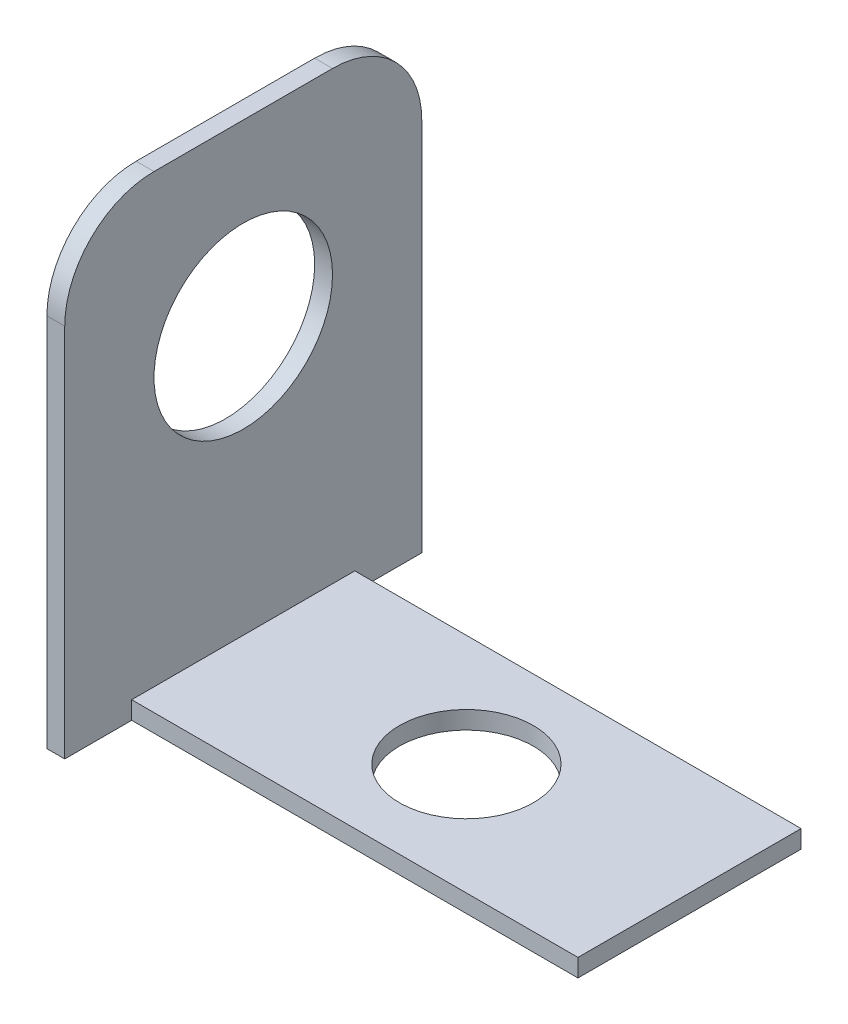
ISO-10303-21;
HEADER;
FILE_DESCRIPTION(('STEP AP214'),'2;1');
FILE_NAME('part.step','',(''),(''),'','','');
FILE_SCHEMA(('AUTOMOTIVE_DESIGN { 1 0 10303 214 1 1 1 1 }'));
ENDSEC;
DATA;
#1=APPLICATION_CONTEXT('core data for automotive mechanical design processes');
#2=APPLICATION_PROTOCOL_DEFINITION('international standard','automotive_design',2000,#1);
#3=PRODUCT_CONTEXT('',#1,'mechanical');
#4=PRODUCT('Part','Part','',(#3));
#5=PRODUCT_RELATED_PRODUCT_CATEGORY('part','',(#4));
#6=PRODUCT_DEFINITION_FORMATION('','',#4);
#7=PRODUCT_DEFINITION_CONTEXT('part definition',#1,'design');
#8=PRODUCT_DEFINITION('design','',#6,#7);
#9=PRODUCT_DEFINITION_SHAPE('','',#8);
#10=(LENGTH_UNIT() NAMED_UNIT(*) SI_UNIT(.MILLI.,.METRE.));
#11=(NAMED_UNIT(*) PLANE_ANGLE_UNIT() SI_UNIT($,.RADIAN.));
#12=(NAMED_UNIT(*) SI_UNIT($,.STERADIAN.) SOLID_ANGLE_UNIT());
#13=UNCERTAINTY_MEASURE_WITH_UNIT(LENGTH_MEASURE(1.E-05),#10,'distance_accuracy_value','');
#14=(GEOMETRIC_REPRESENTATION_CONTEXT(3) GLOBAL_UNCERTAINTY_ASSIGNED_CONTEXT((#13)) GLOBAL_UNIT_ASSIGNED_CONTEXT((#10,
#11,#12)) REPRESENTATION_CONTEXT('',''));
#15=CARTESIAN_POINT('',(0.,0.,0.));
#16=DIRECTION('',(0.,0.,1.));
#17=DIRECTION('',(1.,0.,0.));
#18=AXIS2_PLACEMENT_3D('',#15,#16,#17);
#19=CARTESIAN_POINT('',(50.,0.,40.));
#20=DIRECTION('',(0.,-1.,0.));
#21=DIRECTION('',(1.,0.,0.));
#22=AXIS2_PLACEMENT_3D('',#19,#20,#21);
#23=PLANE('',#22);
#24=CARTESIAN_POINT('',(25.,0.,20.));
#25=DIRECTION('',(0.,1.,0.));
#26=DIRECTION('',(-1.,0.,0.));
#27=AXIS2_PLACEMENT_3D('',#24,#25,#26);
#28=CIRCLE('',#27,7.5);
#29=CARTESIAN_POINT('',(17.5,0.,20.));
#30=VERTEX_POINT('',#29);
#31=EDGE_CURVE('E186',#30,#30,#28,.T.);
#32=ORIENTED_EDGE('',*,*,#31,.F.);
#33=EDGE_LOOP('',(#32));
#34=FACE_BOUND('',#33,.T.);
#35=DIRECTION('',(0.,0.,-1.));
#36=VECTOR('',#35,1.);
#37=CARTESIAN_POINT('',(0.,0.,40.));
#38=LINE('',#37,#36);
#39=CARTESIAN_POINT('',(0.,0.,32.5));
#40=VERTEX_POINT('',#39);
#41=CARTESIAN_POINT('',(0.,0.,7.5));
#42=VERTEX_POINT('',#41);
#43=EDGE_CURVE('E141',#40,#42,#38,.T.);
#44=ORIENTED_EDGE('',*,*,#43,.F.);
#45=DIRECTION('',(-1.,0.,0.));
#46=VECTOR('',#45,1.);
#47=CARTESIAN_POINT('',(0.,0.,32.5));
#48=LINE('',#47,#46);
#49=CARTESIAN_POINT('',(50.,0.,32.5));
#50=VERTEX_POINT('',#49);
#51=EDGE_CURVE('E125',#50,#40,#48,.T.);
#52=ORIENTED_EDGE('',*,*,#51,.F.);
#53=DIRECTION('',(0.,0.,-1.));
#54=VECTOR('',#53,1.);
#55=CARTESIAN_POINT('',(50.,0.,40.));
#56=LINE('',#55,#54);
#57=CARTESIAN_POINT('',(50.,0.,7.5));
#58=VERTEX_POINT('',#57);
#59=EDGE_CURVE('E139',#50,#58,#56,.T.);
#60=ORIENTED_EDGE('',*,*,#59,.T.);
#61=DIRECTION('',(-1.,0.,0.));
#62=VECTOR('',#61,1.);
#63=CARTESIAN_POINT('',(0.,0.,7.5));
#64=LINE('',#63,#62);
#65=EDGE_CURVE('E252',#58,#42,#64,.T.);
#66=ORIENTED_EDGE('',*,*,#65,.T.);
#67=EDGE_LOOP('',(#44,#52,#60,#66));
#68=FACE_BOUND('',#67,.T.);
#69=ADVANCED_FACE('F41',(#34,#68),#23,.F.);
#70=CARTESIAN_POINT('',(-2.,-1.99999999999999,40.));
#71=DIRECTION('',(0.,1.,0.));
#72=DIRECTION('',(0.,0.,1.));
#73=AXIS2_PLACEMENT_3D('',#70,#71,#72);
#74=PLANE('',#73);
#75=CARTESIAN_POINT('',(25.,-1.99999999999999,20.));
#76=DIRECTION('',(0.,1.,0.));
#77=DIRECTION('',(0.,0.,1.));
#78=AXIS2_PLACEMENT_3D('',#75,#76,#77);
#79=CIRCLE('',#78,7.5);
#80=CARTESIAN_POINT('',(25.,-1.99999999999999,27.5));
#81=VERTEX_POINT('',#80);
#82=EDGE_CURVE('E182',#81,#81,#79,.T.);
#83=ORIENTED_EDGE('',*,*,#82,.T.);
#84=EDGE_LOOP('',(#83));
#85=FACE_BOUND('',#84,.T.);
#86=DIRECTION('',(-1.,0.,0.));
#87=VECTOR('',#86,1.);
#88=CARTESIAN_POINT('',(-2.,-1.99999999999999,32.5));
#89=LINE('',#88,#87);
#90=CARTESIAN_POINT('',(50.,-2.,32.5));
#91=VERTEX_POINT('',#90);
#92=CARTESIAN_POINT('',(0.,-2.,32.5));
#93=VERTEX_POINT('',#92);
#94=EDGE_CURVE('E128',#91,#93,#89,.T.);
#95=ORIENTED_EDGE('',*,*,#94,.T.);
#96=DIRECTION('',(0.,0.,1.));
#97=VECTOR('',#96,1.);
#98=CARTESIAN_POINT('',(0.,-1.99999999999999,40.));
#99=LINE('',#98,#97);
#100=CARTESIAN_POINT('',(0.,-2.,40.));
#101=VERTEX_POINT('',#100);
#102=EDGE_CURVE('E242',#93,#101,#99,.T.);
#103=ORIENTED_EDGE('',*,*,#102,.T.);
#104=DIRECTION('',(1.,0.,0.));
#105=VECTOR('',#104,1.);
#106=CARTESIAN_POINT('',(-2.,-1.99999999999999,40.));
#107=LINE('',#106,#105);
#108=CARTESIAN_POINT('',(-2.,-1.99999999999999,40.));
#109=VERTEX_POINT('',#108);
#110=EDGE_CURVE('E150',#109,#101,#107,.T.);
#111=ORIENTED_EDGE('',*,*,#110,.F.);
#112=DIRECTION('',(0.,0.,-1.));
#113=VECTOR('',#112,1.);
#114=CARTESIAN_POINT('',(-2.,-1.99999999999999,40.));
#115=LINE('',#114,#113);
#116=CARTESIAN_POINT('',(-2.,-1.99999999999999,0.));
#117=VERTEX_POINT('',#116);
#118=EDGE_CURVE('E154',#109,#117,#115,.T.);
#119=ORIENTED_EDGE('',*,*,#118,.T.);
#120=DIRECTION('',(1.,0.,0.));
#121=VECTOR('',#120,1.);
#122=CARTESIAN_POINT('',(-2.,-1.99999999999999,0.));
#123=LINE('',#122,#121);
#124=CARTESIAN_POINT('',(0.,-1.99999999999999,0.));
#125=VERTEX_POINT('',#124);
#126=EDGE_CURVE('E160',#117,#125,#123,.T.);
#127=ORIENTED_EDGE('',*,*,#126,.T.);
#128=DIRECTION('',(0.,0.,1.));
#129=VECTOR('',#128,1.);
#130=CARTESIAN_POINT('',(0.,-1.99999999999999,40.));
#131=LINE('',#130,#129);
#132=CARTESIAN_POINT('',(0.,-2.,7.5));
#133=VERTEX_POINT('',#132);
#134=EDGE_CURVE('E246',#125,#133,#131,.T.);
#135=ORIENTED_EDGE('',*,*,#134,.T.);
#136=DIRECTION('',(-1.,0.,0.));
#137=VECTOR('',#136,1.);
#138=CARTESIAN_POINT('',(-2.,-1.99999999999999,7.5));
#139=LINE('',#138,#137);
#140=CARTESIAN_POINT('',(50.,-2.,7.5));
#141=VERTEX_POINT('',#140);
#142=EDGE_CURVE('E239',#141,#133,#139,.T.);
#143=ORIENTED_EDGE('',*,*,#142,.F.);
#144=DIRECTION('',(0.,0.,-1.));
#145=VECTOR('',#144,1.);
#146=CARTESIAN_POINT('',(50.,-1.99999999999999,40.));
#147=LINE('',#146,#145);
#148=EDGE_CURVE('E149',#91,#141,#147,.T.);
#149=ORIENTED_EDGE('',*,*,#148,.F.);
#150=EDGE_LOOP('',(#95,#103,#111,#119,#127,#135,#143,#149));
#151=FACE_BOUND('',#150,.T.);
#152=ADVANCED_FACE('F260',(#85,#151),#74,.F.);
#153=CARTESIAN_POINT('',(50.,-1.99999999999999,40.));
#154=DIRECTION('',(-1.,0.,0.));
#155=DIRECTION('',(0.,0.,1.));
#156=AXIS2_PLACEMENT_3D('',#153,#154,#155);
#157=PLANE('',#156);
#158=ORIENTED_EDGE('',*,*,#59,.F.);
#159=DIRECTION('',(0.,1.,0.));
#160=VECTOR('',#159,1.);
#161=CARTESIAN_POINT('',(50.,-290.,32.5));
#162=LINE('',#161,#160);
#163=EDGE_CURVE('E121',#91,#50,#162,.T.);
#164=ORIENTED_EDGE('',*,*,#163,.F.);
#165=ORIENTED_EDGE('',*,*,#148,.T.);
#166=DIRECTION('',(0.,1.,0.));
#167=VECTOR('',#166,1.);
#168=CARTESIAN_POINT('',(50.,-290.,7.5));
#169=LINE('',#168,#167);
#170=EDGE_CURVE('E147',#141,#58,#169,.T.);
#171=ORIENTED_EDGE('',*,*,#170,.T.);
#172=EDGE_LOOP('',(#158,#164,#165,#171));
#173=FACE_BOUND('',#172,.T.);
#174=ADVANCED_FACE('F146',(#173),#157,.F.);
#175=CARTESIAN_POINT('',(0.,0.,40.));
#176=DIRECTION('',(-1.,0.,0.));
#177=DIRECTION('',(0.,0.,1.));
#178=AXIS2_PLACEMENT_3D('',#175,#176,#177);
#179=PLANE('',#178);
#180=CARTESIAN_POINT('',(0.,30.,20.));
#181=DIRECTION('',(1.,0.,0.));
#182=DIRECTION('',(0.,0.,-1.));
#183=AXIS2_PLACEMENT_3D('',#180,#181,#182);
#184=CIRCLE('',#183,10.);
#185=CARTESIAN_POINT('',(0.,30.,9.99999999999999));
#186=VERTEX_POINT('',#185);
#187=EDGE_CURVE('E181',#186,#186,#184,.T.);
#188=ORIENTED_EDGE('',*,*,#187,.F.);
#189=EDGE_LOOP('',(#188));
#190=FACE_BOUND('',#189,.T.);
#191=DIRECTION('',(0.,1.,0.));
#192=VECTOR('',#191,1.);
#193=CARTESIAN_POINT('',(0.,0.,0.));
#194=LINE('',#193,#192);
#195=CARTESIAN_POINT('',(0.,40.,0.));
#196=VERTEX_POINT('',#195);
#197=EDGE_CURVE('E57',#125,#196,#194,.T.);
#198=ORIENTED_EDGE('',*,*,#197,.T.);
#199=CARTESIAN_POINT('',(0.,40.,10.));
#200=DIRECTION('',(-1.,0.,0.));
#201=DIRECTION('',(0.,0.,1.));
#202=AXIS2_PLACEMENT_3D('',#199,#200,#201);
#203=CIRCLE('',#202,10.);
#204=CARTESIAN_POINT('',(0.,50.,10.));
#205=VERTEX_POINT('',#204);
#206=EDGE_CURVE('E50',#196,#205,#203,.F.);
#207=ORIENTED_EDGE('',*,*,#206,.T.);
#208=DIRECTION('',(0.,0.,-1.));
#209=VECTOR('',#208,1.);
#210=CARTESIAN_POINT('',(0.,50.,40.));
#211=LINE('',#210,#209);
#212=CARTESIAN_POINT('',(0.,50.,30.));
#213=VERTEX_POINT('',#212);
#214=EDGE_CURVE('E170',#213,#205,#211,.T.);
#215=ORIENTED_EDGE('',*,*,#214,.F.);
#216=CARTESIAN_POINT('',(0.,40.,30.));
#217=DIRECTION('',(-1.,0.,0.));
#218=DIRECTION('',(0.,0.,1.));
#219=AXIS2_PLACEMENT_3D('',#216,#217,#218);
#220=CIRCLE('',#219,10.);
#221=CARTESIAN_POINT('',(0.,40.,40.));
#222=VERTEX_POINT('',#221);
#223=EDGE_CURVE('E65',#213,#222,#220,.F.);
#224=ORIENTED_EDGE('',*,*,#223,.T.);
#225=DIRECTION('',(0.,1.,0.));
#226=VECTOR('',#225,1.);
#227=CARTESIAN_POINT('',(0.,0.,40.));
#228=LINE('',#227,#226);
#229=EDGE_CURVE('E224',#101,#222,#228,.T.);
#230=ORIENTED_EDGE('',*,*,#229,.F.);
#231=ORIENTED_EDGE('',*,*,#102,.F.);
#232=DIRECTION('',(0.,1.,0.));
#233=VECTOR('',#232,1.);
#234=CARTESIAN_POINT('',(0.,-290.,32.5));
#235=LINE('',#234,#233);
#236=EDGE_CURVE('E134',#93,#40,#235,.T.);
#237=ORIENTED_EDGE('',*,*,#236,.T.);
#238=ORIENTED_EDGE('',*,*,#43,.T.);
#239=DIRECTION('',(0.,1.,0.));
#240=VECTOR('',#239,1.);
#241=CARTESIAN_POINT('',(0.,-290.,7.5));
#242=LINE('',#241,#240);
#243=EDGE_CURVE('E143',#133,#42,#242,.T.);
#244=ORIENTED_EDGE('',*,*,#243,.F.);
#245=ORIENTED_EDGE('',*,*,#134,.F.);
#246=EDGE_LOOP('',(#198,#207,#215,#224,#230,#231,#237,#238,#244,#245));
#247=FACE_BOUND('',#246,.T.);
#248=ADVANCED_FACE('F205',(#190,#247),#179,.F.);
#249=CARTESIAN_POINT('',(0.,50.,40.));
#250=DIRECTION('',(0.,-1.,0.));
#251=DIRECTION('',(0.,0.,-1.));
#252=AXIS2_PLACEMENT_3D('',#249,#250,#251);
#253=PLANE('',#252);
#254=ORIENTED_EDGE('',*,*,#214,.T.);
#255=DIRECTION('',(-1.,0.,0.));
#256=VECTOR('',#255,1.);
#257=CARTESIAN_POINT('',(-2.,50.,10.));
#258=LINE('',#257,#256);
#259=CARTESIAN_POINT('',(-2.,50.,10.));
#260=VERTEX_POINT('',#259);
#261=EDGE_CURVE('E189',#205,#260,#258,.T.);
#262=ORIENTED_EDGE('',*,*,#261,.T.);
#263=DIRECTION('',(0.,0.,-1.));
#264=VECTOR('',#263,1.);
#265=CARTESIAN_POINT('',(-2.,50.,40.));
#266=LINE('',#265,#264);
#267=CARTESIAN_POINT('',(-2.,50.,30.));
#268=VERTEX_POINT('',#267);
#269=EDGE_CURVE('E166',#268,#260,#266,.T.);
#270=ORIENTED_EDGE('',*,*,#269,.F.);
#271=DIRECTION('',(-1.,0.,0.));
#272=VECTOR('',#271,1.);
#273=CARTESIAN_POINT('',(0.,50.,30.));
#274=LINE('',#273,#272);
#275=EDGE_CURVE('E176',#268,#213,#274,.F.);
#276=ORIENTED_EDGE('',*,*,#275,.T.);
#277=EDGE_LOOP('',(#254,#262,#270,#276));
#278=FACE_BOUND('',#277,.T.);
#279=ADVANCED_FACE('F210',(#278),#253,.F.);
#280=CARTESIAN_POINT('',(-2.,50.,40.));
#281=DIRECTION('',(1.,0.,0.));
#282=DIRECTION('',(0.,0.,-1.));
#283=AXIS2_PLACEMENT_3D('',#280,#281,#282);
#284=PLANE('',#283);
#285=CARTESIAN_POINT('',(-2.,30.,20.));
#286=DIRECTION('',(1.,0.,0.));
#287=DIRECTION('',(0.,0.,-1.));
#288=AXIS2_PLACEMENT_3D('',#285,#286,#287);
#289=CIRCLE('',#288,10.);
#290=CARTESIAN_POINT('',(-2.,30.,9.99999999999999));
#291=VERTEX_POINT('',#290);
#292=EDGE_CURVE('E177',#291,#291,#289,.T.);
#293=ORIENTED_EDGE('',*,*,#292,.T.);
#294=EDGE_LOOP('',(#293));
#295=FACE_BOUND('',#294,.T.);
#296=ORIENTED_EDGE('',*,*,#269,.T.);
#297=CARTESIAN_POINT('',(-2.,40.,10.));
#298=DIRECTION('',(1.,0.,0.));
#299=DIRECTION('',(0.,0.,-1.));
#300=AXIS2_PLACEMENT_3D('',#297,#298,#299);
#301=CIRCLE('',#300,10.);
#302=CARTESIAN_POINT('',(-2.,40.,0.));
#303=VERTEX_POINT('',#302);
#304=EDGE_CURVE('E196',#260,#303,#301,.F.);
#305=ORIENTED_EDGE('',*,*,#304,.T.);
#306=DIRECTION('',(0.,-1.,0.));
#307=VECTOR('',#306,1.);
#308=CARTESIAN_POINT('',(-2.,50.,0.));
#309=LINE('',#308,#307);
#310=EDGE_CURVE('E218',#303,#117,#309,.T.);
#311=ORIENTED_EDGE('',*,*,#310,.T.);
#312=ORIENTED_EDGE('',*,*,#118,.F.);
#313=DIRECTION('',(0.,-1.,0.));
#314=VECTOR('',#313,1.);
#315=CARTESIAN_POINT('',(-2.,50.,40.));
#316=LINE('',#315,#314);
#317=CARTESIAN_POINT('',(-2.,40.,40.));
#318=VERTEX_POINT('',#317);
#319=EDGE_CURVE('E157',#318,#109,#316,.T.);
#320=ORIENTED_EDGE('',*,*,#319,.F.);
#321=CARTESIAN_POINT('',(-2.,40.,30.));
#322=DIRECTION('',(1.,0.,0.));
#323=DIRECTION('',(0.,0.,-1.));
#324=AXIS2_PLACEMENT_3D('',#321,#322,#323);
#325=CIRCLE('',#324,10.);
#326=EDGE_CURVE('E193',#318,#268,#325,.F.);
#327=ORIENTED_EDGE('',*,*,#326,.T.);
#328=EDGE_LOOP('',(#296,#305,#311,#312,#320,#327));
#329=FACE_BOUND('',#328,.T.);
#330=ADVANCED_FACE('F216',(#295,#329),#284,.F.);
#331=CARTESIAN_POINT('',(0.,0.,40.));
#332=DIRECTION('',(0.,0.,-1.));
#333=DIRECTION('',(-1.,0.,0.));
#334=AXIS2_PLACEMENT_3D('',#331,#332,#333);
#335=PLANE('',#334);
#336=ORIENTED_EDGE('',*,*,#110,.T.);
#337=ORIENTED_EDGE('',*,*,#229,.T.);
#338=DIRECTION('',(-1.,0.,0.));
#339=VECTOR('',#338,1.);
#340=CARTESIAN_POINT('',(0.,40.,40.));
#341=LINE('',#340,#339);
#342=EDGE_CURVE('E11',#222,#318,#341,.T.);
#343=ORIENTED_EDGE('',*,*,#342,.T.);
#344=ORIENTED_EDGE('',*,*,#319,.T.);
#345=EDGE_LOOP('',(#336,#337,#343,#344));
#346=FACE_BOUND('',#345,.T.);
#347=ADVANCED_FACE('F267',(#346),#335,.F.);
#348=CARTESIAN_POINT('',(0.,0.,0.));
#349=DIRECTION('',(0.,0.,-1.));
#350=DIRECTION('',(-1.,0.,0.));
#351=AXIS2_PLACEMENT_3D('',#348,#349,#350);
#352=PLANE('',#351);
#353=ORIENTED_EDGE('',*,*,#197,.F.);
#354=ORIENTED_EDGE('',*,*,#126,.F.);
#355=ORIENTED_EDGE('',*,*,#310,.F.);
#356=DIRECTION('',(-1.,0.,0.));
#357=VECTOR('',#356,1.);
#358=CARTESIAN_POINT('',(0.,40.,0.));
#359=LINE('',#358,#357);
#360=EDGE_CURVE('E199',#303,#196,#359,.F.);
#361=ORIENTED_EDGE('',*,*,#360,.T.);
#362=EDGE_LOOP('',(#353,#354,#355,#361));
#363=FACE_BOUND('',#362,.T.);
#364=ADVANCED_FACE('F219',(#363),#352,.T.);
#365=CARTESIAN_POINT('',(-40.,30.,20.));
#366=DIRECTION('',(1.,0.,0.));
#367=DIRECTION('',(0.,0.,-1.));
#368=AXIS2_PLACEMENT_3D('',#365,#366,#367);
#369=CYLINDRICAL_SURFACE('',#368,10.);
#370=ORIENTED_EDGE('',*,*,#187,.T.);
#371=EDGE_LOOP('',(#370));
#372=FACE_BOUND('',#371,.T.);
#373=ORIENTED_EDGE('',*,*,#292,.F.);
#374=EDGE_LOOP('',(#373));
#375=FACE_BOUND('',#374,.T.);
#376=ADVANCED_FACE('F299',(#372,#375),#369,.F.);
#377=CARTESIAN_POINT('',(25.,-40.,20.));
#378=DIRECTION('',(0.,1.,0.));
#379=DIRECTION('',(-1.,0.,0.));
#380=AXIS2_PLACEMENT_3D('',#377,#378,#379);
#381=CYLINDRICAL_SURFACE('',#380,7.5);
#382=ORIENTED_EDGE('',*,*,#31,.T.);
#383=EDGE_LOOP('',(#382));
#384=FACE_BOUND('',#383,.T.);
#385=ORIENTED_EDGE('',*,*,#82,.F.);
#386=EDGE_LOOP('',(#385));
#387=FACE_BOUND('',#386,.T.);
#388=ADVANCED_FACE('F276',(#384,#387),#381,.F.);
#389=CARTESIAN_POINT('',(0.,40.,10.));
#390=DIRECTION('',(1.,0.,0.));
#391=DIRECTION('',(0.,0.,-1.));
#392=AXIS2_PLACEMENT_3D('',#389,#390,#391);
#393=CYLINDRICAL_SURFACE('',#392,10.);
#394=ORIENTED_EDGE('',*,*,#206,.F.);
#395=ORIENTED_EDGE('',*,*,#360,.F.);
#396=ORIENTED_EDGE('',*,*,#304,.F.);
#397=ORIENTED_EDGE('',*,*,#261,.F.);
#398=EDGE_LOOP('',(#394,#395,#396,#397));
#399=FACE_BOUND('',#398,.T.);
#400=ADVANCED_FACE('F213',(#399),#393,.T.);
#401=CARTESIAN_POINT('',(0.,40.,30.));
#402=DIRECTION('',(-1.,0.,0.));
#403=DIRECTION('',(0.,0.,1.));
#404=AXIS2_PLACEMENT_3D('',#401,#402,#403);
#405=CYLINDRICAL_SURFACE('',#404,10.);
#406=ORIENTED_EDGE('',*,*,#223,.F.);
#407=ORIENTED_EDGE('',*,*,#275,.F.);
#408=ORIENTED_EDGE('',*,*,#326,.F.);
#409=ORIENTED_EDGE('',*,*,#342,.F.);
#410=EDGE_LOOP('',(#406,#407,#408,#409));
#411=FACE_BOUND('',#410,.T.);
#412=ADVANCED_FACE('F43',(#411),#405,.T.);
#413=CARTESIAN_POINT('',(0.,-290.,7.5));
#414=DIRECTION('',(0.,0.,-1.));
#415=DIRECTION('',(-1.,0.,0.));
#416=AXIS2_PLACEMENT_3D('',#413,#414,#415);
#417=PLANE('',#416);
#418=ORIENTED_EDGE('',*,*,#142,.T.);
#419=ORIENTED_EDGE('',*,*,#243,.T.);
#420=ORIENTED_EDGE('',*,*,#65,.F.);
#421=ORIENTED_EDGE('',*,*,#170,.F.);
#422=EDGE_LOOP('',(#418,#419,#420,#421));
#423=FACE_BOUND('',#422,.T.);
#424=ADVANCED_FACE('F264',(#423),#417,.T.);
#425=CARTESIAN_POINT('',(0.,-290.,32.5));
#426=DIRECTION('',(0.,0.,-1.));
#427=DIRECTION('',(-1.,0.,0.));
#428=AXIS2_PLACEMENT_3D('',#425,#426,#427);
#429=PLANE('',#428);
#430=ORIENTED_EDGE('',*,*,#163,.T.);
#431=ORIENTED_EDGE('',*,*,#51,.T.);
#432=ORIENTED_EDGE('',*,*,#236,.F.);
#433=ORIENTED_EDGE('',*,*,#94,.F.);
#434=EDGE_LOOP('',(#430,#431,#432,#433));
#435=FACE_BOUND('',#434,.T.);
#436=ADVANCED_FACE('F123',(#435),#429,.F.);
#437=CLOSED_SHELL('',(#69,#152,#174,#248,#279,#330,#347,#364,#376,#388,#400,#412,#424,#436));
#438=MANIFOLD_SOLID_BREP('B2',#437);
#439=ADVANCED_BREP_SHAPE_REPRESENTATION('',(#18,#438),#14);
#440=SHAPE_DEFINITION_REPRESENTATION(#9,#439);
ENDSEC;
END-ISO-10303-21;
